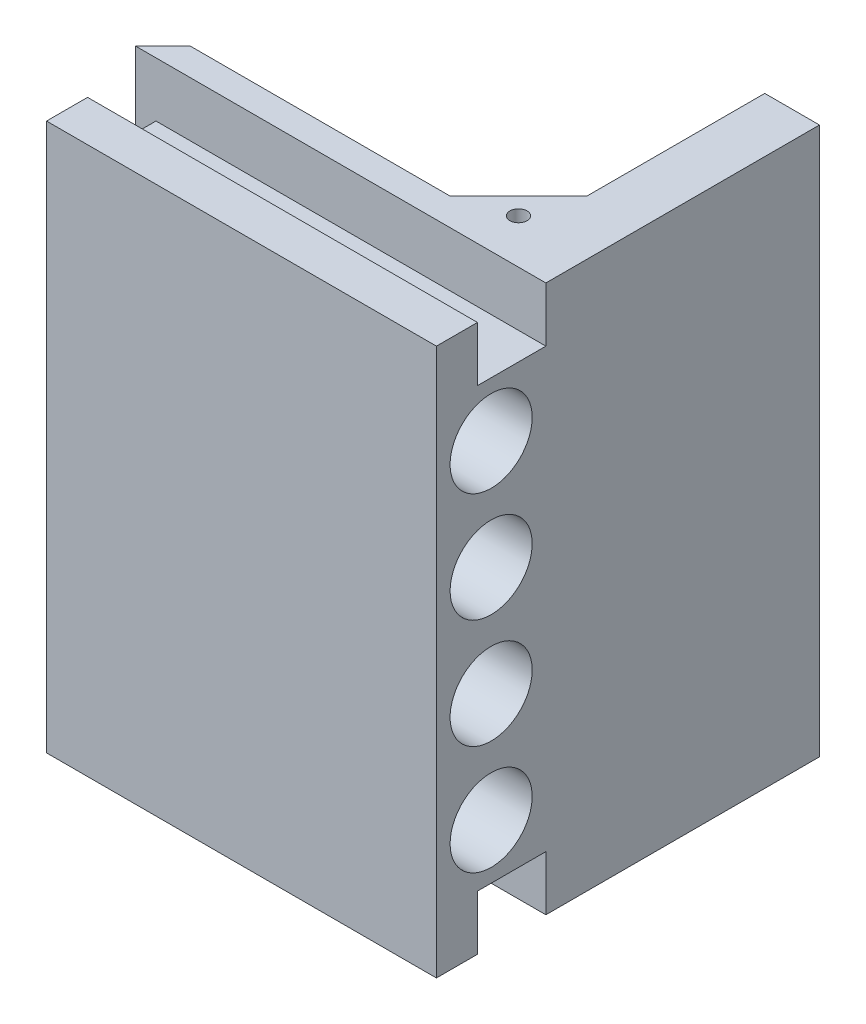
ISO-10303-21;
HEADER;
FILE_DESCRIPTION(('STEP AP214'),'2;1');
FILE_NAME('part.step','',(''),(''),'','','');
FILE_SCHEMA(('AUTOMOTIVE_DESIGN { 1 0 10303 214 1 1 1 1 }'));
ENDSEC;
DATA;
#1=APPLICATION_CONTEXT('core data for automotive mechanical design processes');
#2=APPLICATION_PROTOCOL_DEFINITION('international standard','automotive_design',2000,#1);
#3=PRODUCT_CONTEXT('',#1,'mechanical');
#4=PRODUCT('Part','Part','',(#3));
#5=PRODUCT_RELATED_PRODUCT_CATEGORY('part','',(#4));
#6=PRODUCT_DEFINITION_FORMATION('','',#4);
#7=PRODUCT_DEFINITION_CONTEXT('part definition',#1,'design');
#8=PRODUCT_DEFINITION('design','',#6,#7);
#9=PRODUCT_DEFINITION_SHAPE('','',#8);
#10=(LENGTH_UNIT() NAMED_UNIT(*) SI_UNIT(.MILLI.,.METRE.));
#11=(NAMED_UNIT(*) PLANE_ANGLE_UNIT() SI_UNIT($,.RADIAN.));
#12=(NAMED_UNIT(*) SI_UNIT($,.STERADIAN.) SOLID_ANGLE_UNIT());
#13=UNCERTAINTY_MEASURE_WITH_UNIT(LENGTH_MEASURE(1.E-05),#10,'distance_accuracy_value','');
#14=(GEOMETRIC_REPRESENTATION_CONTEXT(3) GLOBAL_UNCERTAINTY_ASSIGNED_CONTEXT((#13)) GLOBAL_UNIT_ASSIGNED_CONTEXT((#10,
#11,#12)) REPRESENTATION_CONTEXT('',''));
#15=CARTESIAN_POINT('',(0.,0.,0.));
#16=DIRECTION('',(0.,0.,1.));
#17=DIRECTION('',(1.,0.,0.));
#18=AXIS2_PLACEMENT_3D('',#15,#16,#17);
#19=CARTESIAN_POINT('',(-15.3516499079451,0.,15.687272498387));
#20=DIRECTION('',(0.707106781186544,0.,0.707106781186551));
#21=DIRECTION('',(0.,-1.,0.));
#22=AXIS2_PLACEMENT_3D('',#19,#20,#21);
#23=PLANE('',#22);
#24=DIRECTION('',(0.707106781186551,0.,-0.707106781186544));
#25=VECTOR('',#24,1.);
#26=CARTESIAN_POINT('',(-15.3516499079451,-4.00000000000001,15.687272498387));
#27=LINE('',#26,#25);
#28=CARTESIAN_POINT('',(-15.3516499079451,-4.00000000000001,15.687272498387));
#29=VERTEX_POINT('',#28);
#30=CARTESIAN_POINT('',(-5.35164990794507,-4.00000000000001,5.68727249838705));
#31=VERTEX_POINT('',#30);
#32=EDGE_CURVE('E11',#29,#31,#27,.T.);
#33=ORIENTED_EDGE('',*,*,#32,.F.);
#34=DIRECTION('',(0.,-1.,0.));
#35=VECTOR('',#34,1.);
#36=CARTESIAN_POINT('',(-15.3516499079451,0.,15.687272498387));
#37=LINE('',#36,#35);
#38=CARTESIAN_POINT('',(-15.3516499079451,0.,15.687272498387));
#39=VERTEX_POINT('',#38);
#40=EDGE_CURVE('E184',#39,#29,#37,.T.);
#41=ORIENTED_EDGE('',*,*,#40,.F.);
#42=DIRECTION('',(-0.707106781186551,0.,0.707106781186544));
#43=VECTOR('',#42,1.);
#44=CARTESIAN_POINT('',(-15.3516499079451,0.,15.687272498387));
#45=LINE('',#44,#43);
#46=CARTESIAN_POINT('',(-5.35164990794507,0.,5.68727249838709));
#47=VERTEX_POINT('',#46);
#48=EDGE_CURVE('E182',#47,#39,#45,.T.);
#49=ORIENTED_EDGE('',*,*,#48,.F.);
#50=DIRECTION('',(0.,1.,0.));
#51=VECTOR('',#50,1.);
#52=CARTESIAN_POINT('',(-5.35164990794507,0.,5.68727249838709));
#53=LINE('',#52,#51);
#54=EDGE_CURVE('E65',#31,#47,#53,.T.);
#55=ORIENTED_EDGE('',*,*,#54,.F.);
#56=EDGE_LOOP('',(#33,#41,#49,#55));
#57=FACE_BOUND('',#56,.T.);
#58=ADVANCED_FACE('F41',(#57),#23,.F.);
#59=DIRECTION('',(-0.707106781186551,0.,0.707106781186544));
#60=VECTOR('',#59,1.);
#61=CARTESIAN_POINT('',(-15.3516499079451,-76.,15.687272498387));
#62=LINE('',#61,#60);
#63=CARTESIAN_POINT('',(-5.35164990794507,-76.,5.68727249838705));
#64=VERTEX_POINT('',#63);
#65=CARTESIAN_POINT('',(-15.3516499079452,-76.,15.687272498387));
#66=VERTEX_POINT('',#65);
#67=EDGE_CURVE('E50',#64,#66,#62,.T.);
#68=ORIENTED_EDGE('',*,*,#67,.F.);
#69=CARTESIAN_POINT('',(-5.35164990794509,-80.,5.68727249838709));
#70=VERTEX_POINT('',#69);
#71=EDGE_CURVE('E183',#70,#64,#53,.T.);
#72=ORIENTED_EDGE('',*,*,#71,.F.);
#73=DIRECTION('',(0.707106781186551,0.,-0.707106781186544));
#74=VECTOR('',#73,1.);
#75=CARTESIAN_POINT('',(0.167811295221033,-80.,0.167811295221035));
#76=LINE('',#75,#74);
#77=CARTESIAN_POINT('',(-15.3516499079452,-80.,15.687272498387));
#78=VERTEX_POINT('',#77);
#79=EDGE_CURVE('E187',#78,#70,#76,.T.);
#80=ORIENTED_EDGE('',*,*,#79,.F.);
#81=EDGE_CURVE('E188',#66,#78,#37,.T.);
#82=ORIENTED_EDGE('',*,*,#81,.F.);
#83=EDGE_LOOP('',(#68,#72,#80,#82));
#84=FACE_BOUND('',#83,.T.);
#85=ADVANCED_FACE('F201',(#84),#23,.F.);
#86=CARTESIAN_POINT('',(-18.832188704779,-80.,-18.832188704779));
#87=DIRECTION('',(-0.707106781186548,0.,-0.707106781186548));
#88=DIRECTION('',(-0.707106781186548,0.,0.707106781186548));
#89=AXIS2_PLACEMENT_3D('',#86,#87,#88);
#90=PLANE('',#89);
#91=DIRECTION('',(-0.707106781186548,0.,0.707106781186548));
#92=VECTOR('',#91,1.);
#93=CARTESIAN_POINT('',(-18.832188704779,0.,-18.832188704779));
#94=LINE('',#93,#92);
#95=CARTESIAN_POINT('',(-53.3516499079451,0.,15.687272498387));
#96=VERTEX_POINT('',#95);
#97=CARTESIAN_POINT('',(-57.3516499079451,0.,19.687272498387));
#98=VERTEX_POINT('',#97);
#99=EDGE_CURVE('E233',#96,#98,#94,.T.);
#100=ORIENTED_EDGE('',*,*,#99,.F.);
#101=DIRECTION('',(0.,1.,0.));
#102=VECTOR('',#101,1.);
#103=CARTESIAN_POINT('',(-53.3516499079451,0.,15.687272498387));
#104=LINE('',#103,#102);
#105=CARTESIAN_POINT('',(-53.3516499079451,-80.,15.687272498387));
#106=VERTEX_POINT('',#105);
#107=EDGE_CURVE('E343',#106,#96,#104,.T.);
#108=ORIENTED_EDGE('',*,*,#107,.F.);
#109=DIRECTION('',(-0.707106781186548,0.,0.707106781186548));
#110=VECTOR('',#109,1.);
#111=CARTESIAN_POINT('',(-18.832188704779,-80.,-18.832188704779));
#112=LINE('',#111,#110);
#113=CARTESIAN_POINT('',(-57.3516499079451,-80.,19.687272498387));
#114=VERTEX_POINT('',#113);
#115=EDGE_CURVE('E240',#106,#114,#112,.T.);
#116=ORIENTED_EDGE('',*,*,#115,.T.);
#117=DIRECTION('',(0.,1.,0.));
#118=VECTOR('',#117,1.);
#119=CARTESIAN_POINT('',(-57.3516499079451,-80.,19.687272498387));
#120=LINE('',#119,#118);
#121=EDGE_CURVE('E218',#114,#98,#120,.T.);
#122=ORIENTED_EDGE('',*,*,#121,.T.);
#123=EDGE_LOOP('',(#100,#108,#116,#122));
#124=FACE_BOUND('',#123,.T.);
#125=ADVANCED_FACE('F381',(#124),#90,.T.);
#126=CARTESIAN_POINT('',(-54.3516499079451,-7.99999999999999,19.687272498387));
#127=DIRECTION('',(0.,1.,0.));
#128=DIRECTION('',(0.,0.,1.));
#129=AXIS2_PLACEMENT_3D('',#126,#127,#128);
#130=PLANE('',#129);
#131=DIRECTION('',(0.,0.,1.));
#132=VECTOR('',#131,1.);
#133=CARTESIAN_POINT('',(-54.3516499079451,-7.99999999999999,19.687272498387));
#134=LINE('',#133,#132);
#135=CARTESIAN_POINT('',(-54.3516499079451,-7.99999999999999,19.687272498387));
#136=VERTEX_POINT('',#135);
#137=CARTESIAN_POINT('',(-54.3516499079451,-7.99999999999999,29.6872724983871));
#138=VERTEX_POINT('',#137);
#139=EDGE_CURVE('E267',#136,#138,#134,.T.);
#140=ORIENTED_EDGE('',*,*,#139,.T.);
#141=DIRECTION('',(-1.,0.,0.));
#142=VECTOR('',#141,1.);
#143=CARTESIAN_POINT('',(-54.3516499079451,-7.99999999999999,29.6872724983871));
#144=LINE('',#143,#142);
#145=CARTESIAN_POINT('',(2.64835009205493,-7.99999999999999,29.6872724983871));
#146=VERTEX_POINT('',#145);
#147=EDGE_CURVE('E321',#146,#138,#144,.T.);
#148=ORIENTED_EDGE('',*,*,#147,.F.);
#149=DIRECTION('',(0.,0.,1.));
#150=VECTOR('',#149,1.);
#151=CARTESIAN_POINT('',(2.64835009205493,-7.99999999999999,19.687272498387));
#152=LINE('',#151,#150);
#153=CARTESIAN_POINT('',(2.64835009205493,-7.99999999999999,19.687272498387));
#154=VERTEX_POINT('',#153);
#155=EDGE_CURVE('E260',#154,#146,#152,.T.);
#156=ORIENTED_EDGE('',*,*,#155,.F.);
#157=DIRECTION('',(1.,0.,0.));
#158=VECTOR('',#157,1.);
#159=CARTESIAN_POINT('',(-54.3516499079451,-7.99999999999999,19.687272498387));
#160=LINE('',#159,#158);
#161=EDGE_CURVE('E249',#136,#154,#160,.T.);
#162=ORIENTED_EDGE('',*,*,#161,.F.);
#163=EDGE_LOOP('',(#140,#148,#156,#162));
#164=FACE_BOUND('',#163,.T.);
#165=ADVANCED_FACE('F385',(#164),#130,.T.);
#166=CARTESIAN_POINT('',(-54.3516499079451,-72.,19.687272498387));
#167=DIRECTION('',(0.,-1.,0.));
#168=DIRECTION('',(0.,0.,-1.));
#169=AXIS2_PLACEMENT_3D('',#166,#167,#168);
#170=PLANE('',#169);
#171=DIRECTION('',(0.,0.,-1.));
#172=VECTOR('',#171,1.);
#173=CARTESIAN_POINT('',(2.64835009205493,-72.,19.687272498387));
#174=LINE('',#173,#172);
#175=CARTESIAN_POINT('',(2.64835009205493,-72.,29.687272498387));
#176=VERTEX_POINT('',#175);
#177=CARTESIAN_POINT('',(2.64835009205493,-72.,19.687272498387));
#178=VERTEX_POINT('',#177);
#179=EDGE_CURVE('E255',#176,#178,#174,.T.);
#180=ORIENTED_EDGE('',*,*,#179,.F.);
#181=DIRECTION('',(1.,0.,0.));
#182=VECTOR('',#181,1.);
#183=CARTESIAN_POINT('',(-54.3516499079451,-72.,29.687272498387));
#184=LINE('',#183,#182);
#185=CARTESIAN_POINT('',(-54.3516499079451,-72.,29.687272498387));
#186=VERTEX_POINT('',#185);
#187=EDGE_CURVE('E301',#186,#176,#184,.T.);
#188=ORIENTED_EDGE('',*,*,#187,.F.);
#189=DIRECTION('',(0.,0.,-1.));
#190=VECTOR('',#189,1.);
#191=CARTESIAN_POINT('',(-54.3516499079451,-72.,19.687272498387));
#192=LINE('',#191,#190);
#193=CARTESIAN_POINT('',(-54.3516499079451,-72.,19.687272498387));
#194=VERTEX_POINT('',#193);
#195=EDGE_CURVE('E252',#186,#194,#192,.T.);
#196=ORIENTED_EDGE('',*,*,#195,.T.);
#197=DIRECTION('',(1.,0.,0.));
#198=VECTOR('',#197,1.);
#199=CARTESIAN_POINT('',(-54.3516499079451,-72.,19.687272498387));
#200=LINE('',#199,#198);
#201=EDGE_CURVE('E236',#194,#178,#200,.T.);
#202=ORIENTED_EDGE('',*,*,#201,.T.);
#203=EDGE_LOOP('',(#180,#188,#196,#202));
#204=FACE_BOUND('',#203,.T.);
#205=ADVANCED_FACE('F389',(#204),#170,.T.);
#206=CARTESIAN_POINT('',(0.,-80.,-20.312727501613));
#207=DIRECTION('',(0.,0.,1.));
#208=DIRECTION('',(1.,0.,0.));
#209=AXIS2_PLACEMENT_3D('',#206,#207,#208);
#210=PLANE('',#209);
#211=DIRECTION('',(1.,0.,0.));
#212=VECTOR('',#211,1.);
#213=CARTESIAN_POINT('',(0.,-80.,-20.312727501613));
#214=LINE('',#213,#212);
#215=CARTESIAN_POINT('',(-5.35164990794509,-80.,-20.312727501613));
#216=VERTEX_POINT('',#215);
#217=CARTESIAN_POINT('',(2.64835009205492,-80.,-20.312727501613));
#218=VERTEX_POINT('',#217);
#219=EDGE_CURVE('E220',#216,#218,#214,.T.);
#220=ORIENTED_EDGE('',*,*,#219,.F.);
#221=DIRECTION('',(0.,-1.,0.));
#222=VECTOR('',#221,1.);
#223=CARTESIAN_POINT('',(-5.35164990794507,0.,-20.312727501613));
#224=LINE('',#223,#222);
#225=CARTESIAN_POINT('',(-5.35164990794507,0.,-20.312727501613));
#226=VERTEX_POINT('',#225);
#227=EDGE_CURVE('E178',#226,#216,#224,.T.);
#228=ORIENTED_EDGE('',*,*,#227,.F.);
#229=DIRECTION('',(1.,0.,0.));
#230=VECTOR('',#229,1.);
#231=CARTESIAN_POINT('',(0.,0.,-20.312727501613));
#232=LINE('',#231,#230);
#233=CARTESIAN_POINT('',(2.64835009205492,0.,-20.312727501613));
#234=VERTEX_POINT('',#233);
#235=EDGE_CURVE('E216',#226,#234,#232,.T.);
#236=ORIENTED_EDGE('',*,*,#235,.T.);
#237=DIRECTION('',(0.,1.,0.));
#238=VECTOR('',#237,1.);
#239=CARTESIAN_POINT('',(2.64835009205492,-80.,-20.312727501613));
#240=LINE('',#239,#238);
#241=EDGE_CURVE('E203',#218,#234,#240,.T.);
#242=ORIENTED_EDGE('',*,*,#241,.F.);
#243=EDGE_LOOP('',(#220,#228,#236,#242));
#244=FACE_BOUND('',#243,.T.);
#245=ADVANCED_FACE('F401',(#244),#210,.F.);
#246=CARTESIAN_POINT('',(2.64835009205493,-80.,0.));
#247=DIRECTION('',(-1.,0.,0.));
#248=DIRECTION('',(0.,0.,1.));
#249=AXIS2_PLACEMENT_3D('',#246,#247,#248);
#250=PLANE('',#249);
#251=CARTESIAN_POINT('',(2.64835009205493,-16.,27.6872724983871));
#252=DIRECTION('',(1.,0.,0.));
#253=DIRECTION('',(0.,0.,-1.));
#254=AXIS2_PLACEMENT_3D('',#251,#252,#253);
#255=CIRCLE('',#254,6.);
#256=CARTESIAN_POINT('',(2.64835009205493,-16.,21.6872724983871));
#257=VERTEX_POINT('',#256);
#258=EDGE_CURVE('E284',#257,#257,#255,.T.);
#259=ORIENTED_EDGE('',*,*,#258,.F.);
#260=EDGE_LOOP('',(#259));
#261=FACE_BOUND('',#260,.T.);
#262=CARTESIAN_POINT('',(2.64835009205493,-48.,27.6872724983871));
#263=DIRECTION('',(1.,0.,0.));
#264=DIRECTION('',(0.,0.,-1.));
#265=AXIS2_PLACEMENT_3D('',#262,#263,#264);
#266=CIRCLE('',#265,6.);
#267=CARTESIAN_POINT('',(2.64835009205493,-48.,21.6872724983871));
#268=VERTEX_POINT('',#267);
#269=EDGE_CURVE('E285',#268,#268,#266,.T.);
#270=ORIENTED_EDGE('',*,*,#269,.F.);
#271=EDGE_LOOP('',(#270));
#272=FACE_BOUND('',#271,.T.);
#273=CARTESIAN_POINT('',(2.64835009205493,-64.,27.6872724983871));
#274=DIRECTION('',(1.,0.,0.));
#275=DIRECTION('',(0.,0.,1.));
#276=AXIS2_PLACEMENT_3D('',#273,#274,#275);
#277=CIRCLE('',#276,6.);
#278=CARTESIAN_POINT('',(2.64835009205493,-64.,33.6872724983871));
#279=VERTEX_POINT('',#278);
#280=EDGE_CURVE('E271',#279,#279,#277,.T.);
#281=ORIENTED_EDGE('',*,*,#280,.F.);
#282=EDGE_LOOP('',(#281));
#283=FACE_BOUND('',#282,.T.);
#284=CARTESIAN_POINT('',(2.64835009205493,-32.,27.6872724983871));
#285=DIRECTION('',(1.,0.,0.));
#286=DIRECTION('',(0.,0.,1.));
#287=AXIS2_PLACEMENT_3D('',#284,#285,#286);
#288=CIRCLE('',#287,6.);
#289=CARTESIAN_POINT('',(2.64835009205493,-32.,33.6872724983871));
#290=VERTEX_POINT('',#289);
#291=EDGE_CURVE('E278',#290,#290,#288,.T.);
#292=ORIENTED_EDGE('',*,*,#291,.F.);
#293=EDGE_LOOP('',(#292));
#294=FACE_BOUND('',#293,.T.);
#295=DIRECTION('',(0.,0.,1.));
#296=VECTOR('',#295,1.);
#297=CARTESIAN_POINT('',(2.64835009205493,0.,0.));
#298=LINE('',#297,#296);
#299=CARTESIAN_POINT('',(2.64835009205493,0.,19.687272498387));
#300=VERTEX_POINT('',#299);
#301=EDGE_CURVE('E238',#234,#300,#298,.T.);
#302=ORIENTED_EDGE('',*,*,#301,.T.);
#303=DIRECTION('',(0.,1.,0.));
#304=VECTOR('',#303,1.);
#305=CARTESIAN_POINT('',(2.64835009205493,-80.,19.687272498387));
#306=LINE('',#305,#304);
#307=EDGE_CURVE('E213',#154,#300,#306,.T.);
#308=ORIENTED_EDGE('',*,*,#307,.F.);
#309=ORIENTED_EDGE('',*,*,#155,.T.);
#310=DIRECTION('',(0.,-1.,0.));
#311=VECTOR('',#310,1.);
#312=CARTESIAN_POINT('',(2.64835009205493,0.,29.6872724983871));
#313=LINE('',#312,#311);
#314=CARTESIAN_POINT('',(2.64835009205493,0.,29.6872724983871));
#315=VERTEX_POINT('',#314);
#316=EDGE_CURVE('E305',#315,#146,#313,.T.);
#317=ORIENTED_EDGE('',*,*,#316,.F.);
#318=DIRECTION('',(0.,0.,-1.));
#319=VECTOR('',#318,1.);
#320=CARTESIAN_POINT('',(2.64835009205493,0.,35.6872724983871));
#321=LINE('',#320,#319);
#322=CARTESIAN_POINT('',(2.64835009205493,0.,35.6872724983871));
#323=VERTEX_POINT('',#322);
#324=EDGE_CURVE('E327',#323,#315,#321,.T.);
#325=ORIENTED_EDGE('',*,*,#324,.F.);
#326=DIRECTION('',(0.,-1.,0.));
#327=VECTOR('',#326,1.);
#328=CARTESIAN_POINT('',(2.64835009205493,-7.99999999999999,35.6872724983871));
#329=LINE('',#328,#327);
#330=CARTESIAN_POINT('',(2.64835009205493,-80.,35.687272498387));
#331=VERTEX_POINT('',#330);
#332=EDGE_CURVE('E258',#323,#331,#329,.T.);
#333=ORIENTED_EDGE('',*,*,#332,.T.);
#334=DIRECTION('',(0.,0.,1.));
#335=VECTOR('',#334,1.);
#336=CARTESIAN_POINT('',(2.64835009205493,-80.,35.687272498387));
#337=LINE('',#336,#335);
#338=CARTESIAN_POINT('',(2.64835009205493,-80.,29.687272498387));
#339=VERTEX_POINT('',#338);
#340=EDGE_CURVE('E308',#339,#331,#337,.T.);
#341=ORIENTED_EDGE('',*,*,#340,.F.);
#342=DIRECTION('',(0.,1.,0.));
#343=VECTOR('',#342,1.);
#344=CARTESIAN_POINT('',(2.64835009205493,-80.,29.687272498387));
#345=LINE('',#344,#343);
#346=EDGE_CURVE('E297',#339,#176,#345,.T.);
#347=ORIENTED_EDGE('',*,*,#346,.T.);
#348=ORIENTED_EDGE('',*,*,#179,.T.);
#349=CARTESIAN_POINT('',(2.64835009205493,-80.,19.687272498387));
#350=VERTEX_POINT('',#349);
#351=EDGE_CURVE('E205',#350,#178,#306,.T.);
#352=ORIENTED_EDGE('',*,*,#351,.F.);
#353=DIRECTION('',(0.,0.,1.));
#354=VECTOR('',#353,1.);
#355=CARTESIAN_POINT('',(2.64835009205493,-80.,0.));
#356=LINE('',#355,#354);
#357=EDGE_CURVE('E225',#218,#350,#356,.T.);
#358=ORIENTED_EDGE('',*,*,#357,.F.);
#359=ORIENTED_EDGE('',*,*,#241,.T.);
#360=EDGE_LOOP('',(#302,#308,#309,#317,#325,#333,#341,#347,#348,#352,#358,#359));
#361=FACE_BOUND('',#360,.T.);
#362=ADVANCED_FACE('F397',(#261,#272,#283,#294,#361),#250,.F.);
#363=CARTESIAN_POINT('',(0.,-80.,19.687272498387));
#364=DIRECTION('',(0.,0.,1.));
#365=DIRECTION('',(1.,0.,0.));
#366=AXIS2_PLACEMENT_3D('',#363,#364,#365);
#367=PLANE('',#366);
#368=ORIENTED_EDGE('',*,*,#201,.F.);
#369=DIRECTION('',(0.,1.,0.));
#370=VECTOR('',#369,1.);
#371=CARTESIAN_POINT('',(-54.3516499079451,-7.99999999999999,19.687272498387));
#372=LINE('',#371,#370);
#373=EDGE_CURVE('E257',#194,#136,#372,.T.);
#374=ORIENTED_EDGE('',*,*,#373,.T.);
#375=ORIENTED_EDGE('',*,*,#161,.T.);
#376=ORIENTED_EDGE('',*,*,#307,.T.);
#377=DIRECTION('',(1.,0.,0.));
#378=VECTOR('',#377,1.);
#379=CARTESIAN_POINT('',(0.,0.,19.687272498387));
#380=LINE('',#379,#378);
#381=EDGE_CURVE('E235',#98,#300,#380,.T.);
#382=ORIENTED_EDGE('',*,*,#381,.F.);
#383=ORIENTED_EDGE('',*,*,#121,.F.);
#384=DIRECTION('',(1.,0.,0.));
#385=VECTOR('',#384,1.);
#386=CARTESIAN_POINT('',(0.,-80.,19.687272498387));
#387=LINE('',#386,#385);
#388=EDGE_CURVE('E229',#114,#350,#387,.T.);
#389=ORIENTED_EDGE('',*,*,#388,.T.);
#390=ORIENTED_EDGE('',*,*,#351,.T.);
#391=EDGE_LOOP('',(#368,#374,#375,#376,#382,#383,#389,#390));
#392=FACE_BOUND('',#391,.T.);
#393=ADVANCED_FACE('F393',(#392),#367,.T.);
#394=CARTESIAN_POINT('',(0.,-80.,0.));
#395=DIRECTION('',(0.,1.,0.));
#396=DIRECTION('',(0.,0.,1.));
#397=AXIS2_PLACEMENT_3D('',#394,#395,#396);
#398=PLANE('',#397);
#399=CARTESIAN_POINT('',(-7.85164990794509,-80.,13.1872724983871));
#400=DIRECTION('',(0.,1.,0.));
#401=DIRECTION('',(0.,0.,1.));
#402=AXIS2_PLACEMENT_3D('',#399,#400,#401);
#403=CIRCLE('',#402,1.25);
#404=CARTESIAN_POINT('',(-7.85164990794509,-80.,14.4372724983871));
#405=VERTEX_POINT('',#404);
#406=EDGE_CURVE('E356',#405,#405,#403,.T.);
#407=ORIENTED_EDGE('',*,*,#406,.T.);
#408=EDGE_LOOP('',(#407));
#409=FACE_BOUND('',#408,.T.);
#410=DIRECTION('',(-1.,0.,0.));
#411=VECTOR('',#410,1.);
#412=CARTESIAN_POINT('',(-5.35164990794509,-80.,15.687272498387));
#413=LINE('',#412,#411);
#414=EDGE_CURVE('E340',#78,#106,#413,.T.);
#415=ORIENTED_EDGE('',*,*,#414,.F.);
#416=ORIENTED_EDGE('',*,*,#79,.T.);
#417=DIRECTION('',(0.,0.,-1.));
#418=VECTOR('',#417,1.);
#419=CARTESIAN_POINT('',(-5.35164990794509,-80.,15.687272498387));
#420=LINE('',#419,#418);
#421=EDGE_CURVE('E334',#70,#216,#420,.T.);
#422=ORIENTED_EDGE('',*,*,#421,.T.);
#423=ORIENTED_EDGE('',*,*,#219,.T.);
#424=ORIENTED_EDGE('',*,*,#357,.T.);
#425=ORIENTED_EDGE('',*,*,#388,.F.);
#426=ORIENTED_EDGE('',*,*,#115,.F.);
#427=EDGE_LOOP('',(#415,#416,#422,#423,#424,#425,#426));
#428=FACE_BOUND('',#427,.T.);
#429=ADVANCED_FACE('F396',(#409,#428),#398,.F.);
#430=CARTESIAN_POINT('',(0.,0.,0.));
#431=DIRECTION('',(0.,1.,0.));
#432=DIRECTION('',(0.,0.,1.));
#433=AXIS2_PLACEMENT_3D('',#430,#431,#432);
#434=PLANE('',#433);
#435=CARTESIAN_POINT('',(-7.85164990794509,0.,13.1872724983871));
#436=DIRECTION('',(0.,1.,0.));
#437=DIRECTION('',(0.,0.,1.));
#438=AXIS2_PLACEMENT_3D('',#435,#436,#437);
#439=CIRCLE('',#438,1.25);
#440=CARTESIAN_POINT('',(-7.85164990794509,0.,14.4372724983871));
#441=VERTEX_POINT('',#440);
#442=EDGE_CURVE('E353',#441,#441,#439,.T.);
#443=ORIENTED_EDGE('',*,*,#442,.F.);
#444=EDGE_LOOP('',(#443));
#445=FACE_BOUND('',#444,.T.);
#446=DIRECTION('',(0.,0.,-1.));
#447=VECTOR('',#446,1.);
#448=CARTESIAN_POINT('',(-5.35164990794507,0.,15.687272498387));
#449=LINE('',#448,#447);
#450=EDGE_CURVE('E325',#47,#226,#449,.T.);
#451=ORIENTED_EDGE('',*,*,#450,.F.);
#452=ORIENTED_EDGE('',*,*,#48,.T.);
#453=DIRECTION('',(1.,0.,0.));
#454=VECTOR('',#453,1.);
#455=CARTESIAN_POINT('',(-5.35164990794507,0.,15.687272498387));
#456=LINE('',#455,#454);
#457=EDGE_CURVE('E336',#96,#39,#456,.T.);
#458=ORIENTED_EDGE('',*,*,#457,.F.);
#459=ORIENTED_EDGE('',*,*,#99,.T.);
#460=ORIENTED_EDGE('',*,*,#381,.T.);
#461=ORIENTED_EDGE('',*,*,#301,.F.);
#462=ORIENTED_EDGE('',*,*,#235,.F.);
#463=EDGE_LOOP('',(#451,#452,#458,#459,#460,#461,#462));
#464=FACE_BOUND('',#463,.T.);
#465=ADVANCED_FACE('F405',(#445,#464),#434,.T.);
#466=CARTESIAN_POINT('',(-54.3516499079451,-7.99999999999999,35.6872724983871));
#467=DIRECTION('',(0.,0.,1.));
#468=DIRECTION('',(0.,-1.,0.));
#469=AXIS2_PLACEMENT_3D('',#466,#467,#468);
#470=PLANE('',#469);
#471=ORIENTED_EDGE('',*,*,#332,.F.);
#472=DIRECTION('',(1.,0.,0.));
#473=VECTOR('',#472,1.);
#474=CARTESIAN_POINT('',(-54.3516499079451,0.,35.6872724983871));
#475=LINE('',#474,#473);
#476=CARTESIAN_POINT('',(-54.3516499079451,0.,35.6872724983871));
#477=VERTEX_POINT('',#476);
#478=EDGE_CURVE('E329',#477,#323,#475,.T.);
#479=ORIENTED_EDGE('',*,*,#478,.F.);
#480=DIRECTION('',(0.,-1.,0.));
#481=VECTOR('',#480,1.);
#482=CARTESIAN_POINT('',(-54.3516499079451,-7.99999999999999,35.6872724983871));
#483=LINE('',#482,#481);
#484=CARTESIAN_POINT('',(-54.3516499079451,-80.,35.687272498387));
#485=VERTEX_POINT('',#484);
#486=EDGE_CURVE('E265',#477,#485,#483,.T.);
#487=ORIENTED_EDGE('',*,*,#486,.T.);
#488=DIRECTION('',(-1.,0.,0.));
#489=VECTOR('',#488,1.);
#490=CARTESIAN_POINT('',(-54.3516499079451,-80.,35.687272498387));
#491=LINE('',#490,#489);
#492=EDGE_CURVE('E300',#331,#485,#491,.T.);
#493=ORIENTED_EDGE('',*,*,#492,.F.);
#494=EDGE_LOOP('',(#471,#479,#487,#493));
#495=FACE_BOUND('',#494,.T.);
#496=ADVANCED_FACE('F408',(#495),#470,.T.);
#497=CARTESIAN_POINT('',(-54.3516499079451,0.,0.));
#498=DIRECTION('',(-1.,0.,0.));
#499=DIRECTION('',(0.,0.,1.));
#500=AXIS2_PLACEMENT_3D('',#497,#498,#499);
#501=PLANE('',#500);
#502=ORIENTED_EDGE('',*,*,#373,.F.);
#503=ORIENTED_EDGE('',*,*,#195,.F.);
#504=DIRECTION('',(0.,1.,0.));
#505=VECTOR('',#504,1.);
#506=CARTESIAN_POINT('',(-54.3516499079451,-80.,29.687272498387));
#507=LINE('',#506,#505);
#508=CARTESIAN_POINT('',(-54.3516499079451,-80.,29.687272498387));
#509=VERTEX_POINT('',#508);
#510=EDGE_CURVE('E288',#509,#186,#507,.T.);
#511=ORIENTED_EDGE('',*,*,#510,.F.);
#512=DIRECTION('',(0.,0.,-1.));
#513=VECTOR('',#512,1.);
#514=CARTESIAN_POINT('',(-54.3516499079451,-80.,35.687272498387));
#515=LINE('',#514,#513);
#516=EDGE_CURVE('E304',#485,#509,#515,.T.);
#517=ORIENTED_EDGE('',*,*,#516,.F.);
#518=ORIENTED_EDGE('',*,*,#486,.F.);
#519=DIRECTION('',(0.,0.,1.));
#520=VECTOR('',#519,1.);
#521=CARTESIAN_POINT('',(-54.3516499079451,0.,35.6872724983871));
#522=LINE('',#521,#520);
#523=CARTESIAN_POINT('',(-54.3516499079451,0.,29.6872724983871));
#524=VERTEX_POINT('',#523);
#525=EDGE_CURVE('E324',#524,#477,#522,.T.);
#526=ORIENTED_EDGE('',*,*,#525,.F.);
#527=DIRECTION('',(0.,-1.,0.));
#528=VECTOR('',#527,1.);
#529=CARTESIAN_POINT('',(-54.3516499079451,0.,29.6872724983871));
#530=LINE('',#529,#528);
#531=EDGE_CURVE('E317',#524,#138,#530,.T.);
#532=ORIENTED_EDGE('',*,*,#531,.T.);
#533=ORIENTED_EDGE('',*,*,#139,.F.);
#534=EDGE_LOOP('',(#502,#503,#511,#517,#518,#526,#532,#533));
#535=FACE_BOUND('',#534,.T.);
#536=ADVANCED_FACE('F414',(#535),#501,.T.);
#537=CARTESIAN_POINT('',(-48.3516499079451,-32.,27.6872724983871));
#538=DIRECTION('',(1.,0.,0.));
#539=DIRECTION('',(0.,0.,-1.));
#540=AXIS2_PLACEMENT_3D('',#537,#538,#539);
#541=CYLINDRICAL_SURFACE('',#540,6.);
#542=CARTESIAN_POINT('',(-48.3516499079451,-32.,27.6872724983871));
#543=DIRECTION('',(1.,0.,0.));
#544=DIRECTION('',(0.,0.,1.));
#545=AXIS2_PLACEMENT_3D('',#542,#543,#544);
#546=CIRCLE('',#545,6.);
#547=CARTESIAN_POINT('',(-48.3516499079451,-32.,33.6872724983871));
#548=VERTEX_POINT('',#547);
#549=EDGE_CURVE('E281',#548,#548,#546,.T.);
#550=ORIENTED_EDGE('',*,*,#549,.F.);
#551=EDGE_LOOP('',(#550));
#552=FACE_BOUND('',#551,.T.);
#553=ORIENTED_EDGE('',*,*,#291,.T.);
#554=EDGE_LOOP('',(#553));
#555=FACE_BOUND('',#554,.T.);
#556=ADVANCED_FACE('F421',(#552,#555),#541,.F.);
#557=CARTESIAN_POINT('',(-48.3516499079451,-32.,27.6872724983871));
#558=DIRECTION('',(-1.,0.,0.));
#559=DIRECTION('',(0.,0.,1.));
#560=AXIS2_PLACEMENT_3D('',#557,#558,#559);
#561=PLANE('',#560);
#562=ORIENTED_EDGE('',*,*,#549,.T.);
#563=EDGE_LOOP('',(#562));
#564=FACE_BOUND('',#563,.T.);
#565=ADVANCED_FACE('F427',(#564),#561,.F.);
#566=CARTESIAN_POINT('',(-48.3516499079451,-64.,27.6872724983871));
#567=DIRECTION('',(1.,0.,0.));
#568=DIRECTION('',(0.,0.,-1.));
#569=AXIS2_PLACEMENT_3D('',#566,#567,#568);
#570=CYLINDRICAL_SURFACE('',#569,6.);
#571=CARTESIAN_POINT('',(-48.3516499079451,-64.,27.6872724983871));
#572=DIRECTION('',(1.,0.,0.));
#573=DIRECTION('',(0.,0.,1.));
#574=AXIS2_PLACEMENT_3D('',#571,#572,#573);
#575=CIRCLE('',#574,6.);
#576=CARTESIAN_POINT('',(-48.3516499079451,-64.,33.6872724983871));
#577=VERTEX_POINT('',#576);
#578=EDGE_CURVE('E274',#577,#577,#575,.T.);
#579=ORIENTED_EDGE('',*,*,#578,.F.);
#580=EDGE_LOOP('',(#579));
#581=FACE_BOUND('',#580,.T.);
#582=ORIENTED_EDGE('',*,*,#280,.T.);
#583=EDGE_LOOP('',(#582));
#584=FACE_BOUND('',#583,.T.);
#585=ADVANCED_FACE('F423',(#581,#584),#570,.F.);
#586=CARTESIAN_POINT('',(-48.3516499079451,-64.,27.6872724983871));
#587=DIRECTION('',(-1.,0.,0.));
#588=DIRECTION('',(0.,0.,1.));
#589=AXIS2_PLACEMENT_3D('',#586,#587,#588);
#590=PLANE('',#589);
#591=ORIENTED_EDGE('',*,*,#578,.T.);
#592=EDGE_LOOP('',(#591));
#593=FACE_BOUND('',#592,.T.);
#594=ADVANCED_FACE('F426',(#593),#590,.F.);
#595=CARTESIAN_POINT('',(-48.3516499079451,-48.,27.6872724983871));
#596=DIRECTION('',(1.,0.,0.));
#597=DIRECTION('',(0.,0.,-1.));
#598=AXIS2_PLACEMENT_3D('',#595,#596,#597);
#599=CYLINDRICAL_SURFACE('',#598,6.);
#600=CARTESIAN_POINT('',(-48.3516499079451,-48.,27.6872724983871));
#601=DIRECTION('',(1.,0.,0.));
#602=DIRECTION('',(0.,0.,-1.));
#603=AXIS2_PLACEMENT_3D('',#600,#601,#602);
#604=CIRCLE('',#603,6.);
#605=CARTESIAN_POINT('',(-48.3516499079451,-48.,21.6872724983871));
#606=VERTEX_POINT('',#605);
#607=EDGE_CURVE('E275',#606,#606,#604,.T.);
#608=ORIENTED_EDGE('',*,*,#607,.F.);
#609=EDGE_LOOP('',(#608));
#610=FACE_BOUND('',#609,.T.);
#611=ORIENTED_EDGE('',*,*,#269,.T.);
#612=EDGE_LOOP('',(#611));
#613=FACE_BOUND('',#612,.T.);
#614=ADVANCED_FACE('F431',(#610,#613),#599,.F.);
#615=CARTESIAN_POINT('',(-48.3516499079451,-48.,27.6872724983871));
#616=DIRECTION('',(1.,0.,0.));
#617=DIRECTION('',(0.,0.,-1.));
#618=AXIS2_PLACEMENT_3D('',#615,#616,#617);
#619=PLANE('',#618);
#620=ORIENTED_EDGE('',*,*,#607,.T.);
#621=EDGE_LOOP('',(#620));
#622=FACE_BOUND('',#621,.T.);
#623=ADVANCED_FACE('F441',(#622),#619,.T.);
#624=CARTESIAN_POINT('',(-48.3516499079451,-16.,27.6872724983871));
#625=DIRECTION('',(1.,0.,0.));
#626=DIRECTION('',(0.,0.,-1.));
#627=AXIS2_PLACEMENT_3D('',#624,#625,#626);
#628=CYLINDRICAL_SURFACE('',#627,6.);
#629=CARTESIAN_POINT('',(-48.3516499079451,-16.,27.6872724983871));
#630=DIRECTION('',(1.,0.,0.));
#631=DIRECTION('',(0.,0.,-1.));
#632=AXIS2_PLACEMENT_3D('',#629,#630,#631);
#633=CIRCLE('',#632,6.);
#634=CARTESIAN_POINT('',(-48.3516499079451,-16.,21.6872724983871));
#635=VERTEX_POINT('',#634);
#636=EDGE_CURVE('E263',#635,#635,#633,.T.);
#637=ORIENTED_EDGE('',*,*,#636,.F.);
#638=EDGE_LOOP('',(#637));
#639=FACE_BOUND('',#638,.T.);
#640=ORIENTED_EDGE('',*,*,#258,.T.);
#641=EDGE_LOOP('',(#640));
#642=FACE_BOUND('',#641,.T.);
#643=ADVANCED_FACE('F445',(#639,#642),#628,.F.);
#644=CARTESIAN_POINT('',(-48.3516499079451,-16.,27.6872724983871));
#645=DIRECTION('',(1.,0.,0.));
#646=DIRECTION('',(0.,0.,-1.));
#647=AXIS2_PLACEMENT_3D('',#644,#645,#646);
#648=PLANE('',#647);
#649=ORIENTED_EDGE('',*,*,#636,.T.);
#650=EDGE_LOOP('',(#649));
#651=FACE_BOUND('',#650,.T.);
#652=ADVANCED_FACE('F449',(#651),#648,.T.);
#653=CARTESIAN_POINT('',(-54.3516499079451,-80.,29.687272498387));
#654=DIRECTION('',(0.,0.,1.));
#655=DIRECTION('',(1.,0.,0.));
#656=AXIS2_PLACEMENT_3D('',#653,#654,#655);
#657=PLANE('',#656);
#658=ORIENTED_EDGE('',*,*,#187,.T.);
#659=ORIENTED_EDGE('',*,*,#346,.F.);
#660=DIRECTION('',(1.,0.,0.));
#661=VECTOR('',#660,1.);
#662=CARTESIAN_POINT('',(-54.3516499079451,-80.,29.687272498387));
#663=LINE('',#662,#661);
#664=EDGE_CURVE('E311',#509,#339,#663,.T.);
#665=ORIENTED_EDGE('',*,*,#664,.F.);
#666=ORIENTED_EDGE('',*,*,#510,.T.);
#667=EDGE_LOOP('',(#658,#659,#665,#666));
#668=FACE_BOUND('',#667,.T.);
#669=ADVANCED_FACE('F453',(#668),#657,.F.);
#670=CARTESIAN_POINT('',(0.,-80.,0.));
#671=DIRECTION('',(0.,-1.,0.));
#672=DIRECTION('',(0.,0.,-1.));
#673=AXIS2_PLACEMENT_3D('',#670,#671,#672);
#674=PLANE('',#673);
#675=ORIENTED_EDGE('',*,*,#516,.T.);
#676=ORIENTED_EDGE('',*,*,#664,.T.);
#677=ORIENTED_EDGE('',*,*,#340,.T.);
#678=ORIENTED_EDGE('',*,*,#492,.T.);
#679=EDGE_LOOP('',(#675,#676,#677,#678));
#680=FACE_BOUND('',#679,.T.);
#681=ADVANCED_FACE('F457',(#680),#674,.T.);
#682=CARTESIAN_POINT('',(-54.3516499079451,0.,29.6872724983871));
#683=DIRECTION('',(0.,0.,1.));
#684=DIRECTION('',(1.,0.,0.));
#685=AXIS2_PLACEMENT_3D('',#682,#683,#684);
#686=PLANE('',#685);
#687=ORIENTED_EDGE('',*,*,#147,.T.);
#688=ORIENTED_EDGE('',*,*,#531,.F.);
#689=DIRECTION('',(-1.,0.,0.));
#690=VECTOR('',#689,1.);
#691=CARTESIAN_POINT('',(-54.3516499079451,0.,29.6872724983871));
#692=LINE('',#691,#690);
#693=EDGE_CURVE('E320',#315,#524,#692,.T.);
#694=ORIENTED_EDGE('',*,*,#693,.F.);
#695=ORIENTED_EDGE('',*,*,#316,.T.);
#696=EDGE_LOOP('',(#687,#688,#694,#695));
#697=FACE_BOUND('',#696,.T.);
#698=ADVANCED_FACE('F461',(#697),#686,.F.);
#699=CARTESIAN_POINT('',(0.,0.,0.));
#700=DIRECTION('',(0.,-1.,0.));
#701=DIRECTION('',(0.,0.,-1.));
#702=AXIS2_PLACEMENT_3D('',#699,#700,#701);
#703=PLANE('',#702);
#704=ORIENTED_EDGE('',*,*,#525,.T.);
#705=ORIENTED_EDGE('',*,*,#478,.T.);
#706=ORIENTED_EDGE('',*,*,#324,.T.);
#707=ORIENTED_EDGE('',*,*,#693,.T.);
#708=EDGE_LOOP('',(#704,#705,#706,#707));
#709=FACE_BOUND('',#708,.T.);
#710=ADVANCED_FACE('F465',(#709),#703,.F.);
#711=CARTESIAN_POINT('',(-5.35164990794507,0.,15.687272498387));
#712=DIRECTION('',(1.,0.,0.));
#713=DIRECTION('',(0.,1.,0.));
#714=AXIS2_PLACEMENT_3D('',#711,#712,#713);
#715=PLANE('',#714);
#716=ORIENTED_EDGE('',*,*,#421,.F.);
#717=ORIENTED_EDGE('',*,*,#71,.T.);
#718=DIRECTION('',(0.,0.,1.));
#719=VECTOR('',#718,1.);
#720=CARTESIAN_POINT('',(-5.35164990794507,-76.,5.68727249838705));
#721=LINE('',#720,#719);
#722=CARTESIAN_POINT('',(-5.35164990794507,-76.,15.687272498387));
#723=VERTEX_POINT('',#722);
#724=EDGE_CURVE('E179',#64,#723,#721,.T.);
#725=ORIENTED_EDGE('',*,*,#724,.T.);
#726=DIRECTION('',(0.,-1.,0.));
#727=VECTOR('',#726,1.);
#728=CARTESIAN_POINT('',(-5.35164990794507,-76.,15.687272498387));
#729=LINE('',#728,#727);
#730=CARTESIAN_POINT('',(-5.35164990794507,-4.00000000000001,15.687272498387));
#731=VERTEX_POINT('',#730);
#732=EDGE_CURVE('E177',#731,#723,#729,.T.);
#733=ORIENTED_EDGE('',*,*,#732,.F.);
#734=DIRECTION('',(0.,0.,1.));
#735=VECTOR('',#734,1.);
#736=CARTESIAN_POINT('',(-5.35164990794507,-4.00000000000001,5.68727249838705));
#737=LINE('',#736,#735);
#738=EDGE_CURVE('E168',#31,#731,#737,.T.);
#739=ORIENTED_EDGE('',*,*,#738,.F.);
#740=ORIENTED_EDGE('',*,*,#54,.T.);
#741=ORIENTED_EDGE('',*,*,#450,.T.);
#742=ORIENTED_EDGE('',*,*,#227,.T.);
#743=EDGE_LOOP('',(#716,#717,#725,#733,#739,#740,#741,#742));
#744=FACE_BOUND('',#743,.T.);
#745=ADVANCED_FACE('F175',(#744),#715,.F.);
#746=CARTESIAN_POINT('',(0.,0.,15.687272498387));
#747=DIRECTION('',(0.,0.,-1.));
#748=DIRECTION('',(-1.,0.,0.));
#749=AXIS2_PLACEMENT_3D('',#746,#747,#748);
#750=PLANE('',#749);
#751=ORIENTED_EDGE('',*,*,#107,.T.);
#752=ORIENTED_EDGE('',*,*,#457,.T.);
#753=ORIENTED_EDGE('',*,*,#40,.T.);
#754=DIRECTION('',(1.,0.,0.));
#755=VECTOR('',#754,1.);
#756=CARTESIAN_POINT('',(-53.3516499079451,-4.,15.687272498387));
#757=LINE('',#756,#755);
#758=EDGE_CURVE('E170',#29,#731,#757,.T.);
#759=ORIENTED_EDGE('',*,*,#758,.T.);
#760=ORIENTED_EDGE('',*,*,#732,.T.);
#761=DIRECTION('',(-1.,0.,0.));
#762=VECTOR('',#761,1.);
#763=CARTESIAN_POINT('',(-53.3516499079451,-76.,15.687272498387));
#764=LINE('',#763,#762);
#765=EDGE_CURVE('E57',#723,#66,#764,.T.);
#766=ORIENTED_EDGE('',*,*,#765,.T.);
#767=ORIENTED_EDGE('',*,*,#81,.T.);
#768=ORIENTED_EDGE('',*,*,#414,.T.);
#769=EDGE_LOOP('',(#751,#752,#753,#759,#760,#766,#767,#768));
#770=FACE_BOUND('',#769,.T.);
#771=ADVANCED_FACE('F374',(#770),#750,.T.);
#772=CARTESIAN_POINT('',(-53.3516499079451,-4.,5.68727249838705));
#773=DIRECTION('',(0.,-1.,0.));
#774=DIRECTION('',(1.,0.,0.));
#775=AXIS2_PLACEMENT_3D('',#772,#773,#774);
#776=PLANE('',#775);
#777=CARTESIAN_POINT('',(-7.85164990794509,-4.,13.1872724983871));
#778=DIRECTION('',(0.,-1.,0.));
#779=DIRECTION('',(1.,0.,0.));
#780=AXIS2_PLACEMENT_3D('',#777,#778,#779);
#781=CIRCLE('',#780,1.25);
#782=CARTESIAN_POINT('',(-6.60164990794509,-4.,13.1872724983871));
#783=VERTEX_POINT('',#782);
#784=EDGE_CURVE('E350',#783,#783,#781,.T.);
#785=ORIENTED_EDGE('',*,*,#784,.F.);
#786=EDGE_LOOP('',(#785));
#787=FACE_BOUND('',#786,.T.);
#788=ORIENTED_EDGE('',*,*,#32,.T.);
#789=ORIENTED_EDGE('',*,*,#738,.T.);
#790=ORIENTED_EDGE('',*,*,#758,.F.);
#791=EDGE_LOOP('',(#788,#789,#790));
#792=FACE_BOUND('',#791,.T.);
#793=ADVANCED_FACE('F167',(#787,#792),#776,.T.);
#794=CARTESIAN_POINT('',(-53.3516499079451,-76.,5.68727249838705));
#795=DIRECTION('',(0.,1.,0.));
#796=DIRECTION('',(0.,0.,1.));
#797=AXIS2_PLACEMENT_3D('',#794,#795,#796);
#798=PLANE('',#797);
#799=CARTESIAN_POINT('',(-7.85164990794509,-76.,13.1872724983871));
#800=DIRECTION('',(0.,1.,0.));
#801=DIRECTION('',(0.,0.,1.));
#802=AXIS2_PLACEMENT_3D('',#799,#800,#801);
#803=CIRCLE('',#802,1.25);
#804=CARTESIAN_POINT('',(-7.85164990794509,-76.,14.4372724983871));
#805=VERTEX_POINT('',#804);
#806=EDGE_CURVE('E45',#805,#805,#803,.T.);
#807=ORIENTED_EDGE('',*,*,#806,.F.);
#808=EDGE_LOOP('',(#807));
#809=FACE_BOUND('',#808,.T.);
#810=ORIENTED_EDGE('',*,*,#67,.T.);
#811=ORIENTED_EDGE('',*,*,#765,.F.);
#812=ORIENTED_EDGE('',*,*,#724,.F.);
#813=EDGE_LOOP('',(#810,#811,#812));
#814=FACE_BOUND('',#813,.T.);
#815=ADVANCED_FACE('F197',(#809,#814),#798,.T.);
#816=CARTESIAN_POINT('',(-7.85164990794509,-80.,13.1872724983871));
#817=DIRECTION('',(0.,1.,0.));
#818=DIRECTION('',(0.,0.,1.));
#819=AXIS2_PLACEMENT_3D('',#816,#817,#818);
#820=CYLINDRICAL_SURFACE('',#819,1.25);
#821=ORIENTED_EDGE('',*,*,#806,.T.);
#822=EDGE_LOOP('',(#821));
#823=FACE_BOUND('',#822,.T.);
#824=ORIENTED_EDGE('',*,*,#406,.F.);
#825=EDGE_LOOP('',(#824));
#826=FACE_BOUND('',#825,.T.);
#827=ADVANCED_FACE('F363',(#823,#826),#820,.F.);
#828=ORIENTED_EDGE('',*,*,#784,.T.);
#829=EDGE_LOOP('',(#828));
#830=FACE_BOUND('',#829,.T.);
#831=ORIENTED_EDGE('',*,*,#442,.T.);
#832=EDGE_LOOP('',(#831));
#833=FACE_BOUND('',#832,.T.);
#834=ADVANCED_FACE('F372',(#830,#833),#820,.F.);
#835=CLOSED_SHELL('',(#58,#85,#125,#165,#205,#245,#362,#393,#429,#465,#496,#536,#556,#565,#585,
#594,#614,#623,#643,#652,#669,#681,#698,#710,#745,#771,#793,#815,#827,#834));
#836=MANIFOLD_SOLID_BREP('B2',#835);
#837=ADVANCED_BREP_SHAPE_REPRESENTATION('',(#18,#836),#14);
#838=SHAPE_DEFINITION_REPRESENTATION(#9,#837);
ENDSEC;
END-ISO-10303-21;
